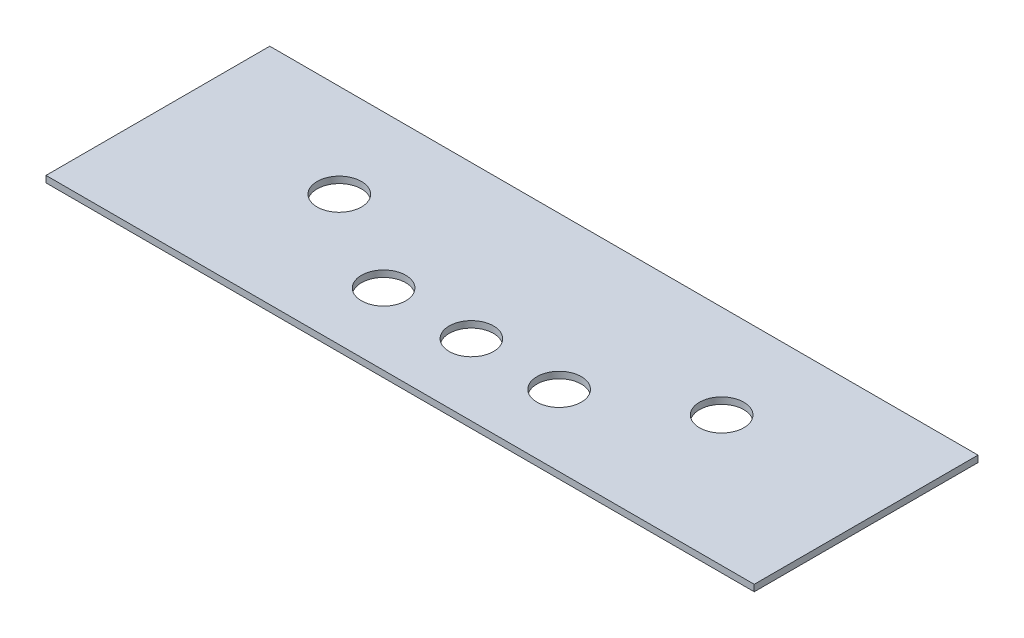
ISO-10303-21;
HEADER;
FILE_DESCRIPTION(('STEP AP214'),'2;1');
FILE_NAME('part.step','',(''),(''),'','','');
FILE_SCHEMA(('AUTOMOTIVE_DESIGN { 1 0 10303 214 1 1 1 1 }'));
ENDSEC;
DATA;
#1=APPLICATION_CONTEXT('core data for automotive mechanical design processes');
#2=APPLICATION_PROTOCOL_DEFINITION('international standard','automotive_design',2000,#1);
#3=PRODUCT_CONTEXT('',#1,'mechanical');
#4=PRODUCT('Part','Part','',(#3));
#5=PRODUCT_RELATED_PRODUCT_CATEGORY('part','',(#4));
#6=PRODUCT_DEFINITION_FORMATION('','',#4);
#7=PRODUCT_DEFINITION_CONTEXT('part definition',#1,'design');
#8=PRODUCT_DEFINITION('design','',#6,#7);
#9=PRODUCT_DEFINITION_SHAPE('','',#8);
#10=(LENGTH_UNIT() NAMED_UNIT(*) SI_UNIT(.MILLI.,.METRE.));
#11=(NAMED_UNIT(*) PLANE_ANGLE_UNIT() SI_UNIT($,.RADIAN.));
#12=(NAMED_UNIT(*) SI_UNIT($,.STERADIAN.) SOLID_ANGLE_UNIT());
#13=UNCERTAINTY_MEASURE_WITH_UNIT(LENGTH_MEASURE(1.E-05),#10,'distance_accuracy_value','');
#14=(GEOMETRIC_REPRESENTATION_CONTEXT(3) GLOBAL_UNCERTAINTY_ASSIGNED_CONTEXT((#13)) GLOBAL_UNIT_ASSIGNED_CONTEXT((#10,
#11,#12)) REPRESENTATION_CONTEXT('',''));
#15=CARTESIAN_POINT('',(0.,0.,0.));
#16=DIRECTION('',(0.,0.,1.));
#17=DIRECTION('',(1.,0.,0.));
#18=AXIS2_PLACEMENT_3D('',#15,#16,#17);
#19=CARTESIAN_POINT('',(-163.,3.,51.5));
#20=DIRECTION('',(1.,0.,0.));
#21=DIRECTION('',(0.,0.,-1.));
#22=AXIS2_PLACEMENT_3D('',#19,#20,#21);
#23=PLANE('',#22);
#24=DIRECTION('',(0.,0.,1.));
#25=VECTOR('',#24,1.);
#26=CARTESIAN_POINT('',(-163.,0.,51.5));
#27=LINE('',#26,#25);
#28=CARTESIAN_POINT('',(-163.,0.,-51.5));
#29=VERTEX_POINT('',#28);
#30=CARTESIAN_POINT('',(-163.,0.,51.5));
#31=VERTEX_POINT('',#30);
#32=EDGE_CURVE('E97',#29,#31,#27,.T.);
#33=ORIENTED_EDGE('',*,*,#32,.T.);
#34=DIRECTION('',(0.,-1.,0.));
#35=VECTOR('',#34,1.);
#36=CARTESIAN_POINT('',(-163.,3.,51.5));
#37=LINE('',#36,#35);
#38=CARTESIAN_POINT('',(-163.,3.,51.5));
#39=VERTEX_POINT('',#38);
#40=EDGE_CURVE('E11',#39,#31,#37,.T.);
#41=ORIENTED_EDGE('',*,*,#40,.F.);
#42=DIRECTION('',(0.,0.,1.));
#43=VECTOR('',#42,1.);
#44=CARTESIAN_POINT('',(-163.,3.,51.5));
#45=LINE('',#44,#43);
#46=CARTESIAN_POINT('',(-163.,3.,-51.5));
#47=VERTEX_POINT('',#46);
#48=EDGE_CURVE('E85',#47,#39,#45,.T.);
#49=ORIENTED_EDGE('',*,*,#48,.F.);
#50=DIRECTION('',(0.,-1.,0.));
#51=VECTOR('',#50,1.);
#52=CARTESIAN_POINT('',(-163.,3.,-51.5));
#53=LINE('',#52,#51);
#54=EDGE_CURVE('E93',#47,#29,#53,.T.);
#55=ORIENTED_EDGE('',*,*,#54,.T.);
#56=EDGE_LOOP('',(#33,#41,#49,#55));
#57=FACE_BOUND('',#56,.T.);
#58=ADVANCED_FACE('F34',(#57),#23,.F.);
#59=CARTESIAN_POINT('',(163.,3.,51.5));
#60=DIRECTION('',(0.,0.,-1.));
#61=DIRECTION('',(-1.,0.,0.));
#62=AXIS2_PLACEMENT_3D('',#59,#60,#61);
#63=PLANE('',#62);
#64=DIRECTION('',(1.,0.,0.));
#65=VECTOR('',#64,1.);
#66=CARTESIAN_POINT('',(163.,0.,51.5));
#67=LINE('',#66,#65);
#68=CARTESIAN_POINT('',(163.,0.,51.5));
#69=VERTEX_POINT('',#68);
#70=EDGE_CURVE('E89',#31,#69,#67,.T.);
#71=ORIENTED_EDGE('',*,*,#70,.T.);
#72=DIRECTION('',(0.,-1.,0.));
#73=VECTOR('',#72,1.);
#74=CARTESIAN_POINT('',(163.,3.,51.5));
#75=LINE('',#74,#73);
#76=CARTESIAN_POINT('',(163.,3.,51.5));
#77=VERTEX_POINT('',#76);
#78=EDGE_CURVE('E42',#77,#69,#75,.T.);
#79=ORIENTED_EDGE('',*,*,#78,.F.);
#80=DIRECTION('',(1.,0.,0.));
#81=VECTOR('',#80,1.);
#82=CARTESIAN_POINT('',(163.,3.,51.5));
#83=LINE('',#82,#81);
#84=EDGE_CURVE('E80',#39,#77,#83,.T.);
#85=ORIENTED_EDGE('',*,*,#84,.F.);
#86=ORIENTED_EDGE('',*,*,#40,.T.);
#87=EDGE_LOOP('',(#71,#79,#85,#86));
#88=FACE_BOUND('',#87,.T.);
#89=ADVANCED_FACE('F88',(#88),#63,.F.);
#90=CARTESIAN_POINT('',(163.,3.,51.5));
#91=DIRECTION('',(-1.,0.,0.));
#92=DIRECTION('',(0.,0.,1.));
#93=AXIS2_PLACEMENT_3D('',#90,#91,#92);
#94=PLANE('',#93);
#95=DIRECTION('',(0.,0.,-1.));
#96=VECTOR('',#95,1.);
#97=CARTESIAN_POINT('',(163.,0.,51.5));
#98=LINE('',#97,#96);
#99=CARTESIAN_POINT('',(163.,0.,-51.5));
#100=VERTEX_POINT('',#99);
#101=EDGE_CURVE('E67',#69,#100,#98,.T.);
#102=ORIENTED_EDGE('',*,*,#101,.T.);
#103=DIRECTION('',(0.,-1.,0.));
#104=VECTOR('',#103,1.);
#105=CARTESIAN_POINT('',(163.,3.,-51.5));
#106=LINE('',#105,#104);
#107=CARTESIAN_POINT('',(163.,3.,-51.5));
#108=VERTEX_POINT('',#107);
#109=EDGE_CURVE('E90',#108,#100,#106,.T.);
#110=ORIENTED_EDGE('',*,*,#109,.F.);
#111=DIRECTION('',(0.,0.,-1.));
#112=VECTOR('',#111,1.);
#113=CARTESIAN_POINT('',(163.,3.,51.5));
#114=LINE('',#113,#112);
#115=EDGE_CURVE('E83',#77,#108,#114,.T.);
#116=ORIENTED_EDGE('',*,*,#115,.F.);
#117=ORIENTED_EDGE('',*,*,#78,.T.);
#118=EDGE_LOOP('',(#102,#110,#116,#117));
#119=FACE_BOUND('',#118,.T.);
#120=ADVANCED_FACE('F91',(#119),#94,.F.);
#121=CARTESIAN_POINT('',(163.,3.,-51.5));
#122=DIRECTION('',(0.,0.,1.));
#123=DIRECTION('',(1.,0.,0.));
#124=AXIS2_PLACEMENT_3D('',#121,#122,#123);
#125=PLANE('',#124);
#126=DIRECTION('',(-1.,0.,0.));
#127=VECTOR('',#126,1.);
#128=CARTESIAN_POINT('',(163.,0.,-51.5));
#129=LINE('',#128,#127);
#130=EDGE_CURVE('E73',#100,#29,#129,.T.);
#131=ORIENTED_EDGE('',*,*,#130,.T.);
#132=ORIENTED_EDGE('',*,*,#54,.F.);
#133=DIRECTION('',(-1.,0.,0.));
#134=VECTOR('',#133,1.);
#135=CARTESIAN_POINT('',(163.,3.,-51.5));
#136=LINE('',#135,#134);
#137=EDGE_CURVE('E50',#108,#47,#136,.T.);
#138=ORIENTED_EDGE('',*,*,#137,.F.);
#139=ORIENTED_EDGE('',*,*,#109,.T.);
#140=EDGE_LOOP('',(#131,#132,#138,#139));
#141=FACE_BOUND('',#140,.T.);
#142=ADVANCED_FACE('F105',(#141),#125,.F.);
#143=CARTESIAN_POINT('',(0.,3.,0.));
#144=DIRECTION('',(0.,1.,0.));
#145=DIRECTION('',(0.,0.,1.));
#146=AXIS2_PLACEMENT_3D('',#143,#144,#145);
#147=PLANE('',#146);
#148=CARTESIAN_POINT('',(-88.,3.,-8.50000000000002));
#149=DIRECTION('',(0.,1.,0.));
#150=DIRECTION('',(0.,0.,1.));
#151=AXIS2_PLACEMENT_3D('',#148,#149,#150);
#152=CIRCLE('',#151,10.2);
#153=CARTESIAN_POINT('',(-88.,3.,1.69999999999998));
#154=VERTEX_POINT('',#153);
#155=EDGE_CURVE('E122',#154,#154,#152,.T.);
#156=ORIENTED_EDGE('',*,*,#155,.F.);
#157=EDGE_LOOP('',(#156));
#158=FACE_BOUND('',#157,.T.);
#159=CARTESIAN_POINT('',(40.4,3.,18.7));
#160=DIRECTION('',(0.,1.,0.));
#161=DIRECTION('',(0.,0.,1.));
#162=AXIS2_PLACEMENT_3D('',#159,#160,#161);
#163=CIRCLE('',#162,10.2);
#164=CARTESIAN_POINT('',(40.4,3.,28.9));
#165=VERTEX_POINT('',#164);
#166=EDGE_CURVE('E129',#165,#165,#163,.T.);
#167=ORIENTED_EDGE('',*,*,#166,.F.);
#168=EDGE_LOOP('',(#167));
#169=FACE_BOUND('',#168,.T.);
#170=CARTESIAN_POINT('',(0.,3.,18.7));
#171=DIRECTION('',(0.,1.,0.));
#172=DIRECTION('',(0.,0.,1.));
#173=AXIS2_PLACEMENT_3D('',#170,#171,#172);
#174=CIRCLE('',#173,10.2);
#175=CARTESIAN_POINT('',(0.,3.,28.9));
#176=VERTEX_POINT('',#175);
#177=EDGE_CURVE('E128',#176,#176,#174,.T.);
#178=ORIENTED_EDGE('',*,*,#177,.F.);
#179=EDGE_LOOP('',(#178));
#180=FACE_BOUND('',#179,.T.);
#181=CARTESIAN_POINT('',(-40.4,3.,18.7));
#182=DIRECTION('',(0.,1.,0.));
#183=DIRECTION('',(0.,0.,1.));
#184=AXIS2_PLACEMENT_3D('',#181,#182,#183);
#185=CIRCLE('',#184,10.2);
#186=CARTESIAN_POINT('',(-40.4,3.,28.9));
#187=VERTEX_POINT('',#186);
#188=EDGE_CURVE('E115',#187,#187,#185,.T.);
#189=ORIENTED_EDGE('',*,*,#188,.F.);
#190=EDGE_LOOP('',(#189));
#191=FACE_BOUND('',#190,.T.);
#192=CARTESIAN_POINT('',(88.,3.,-8.50000000000002));
#193=DIRECTION('',(0.,1.,0.));
#194=DIRECTION('',(0.,0.,1.));
#195=AXIS2_PLACEMENT_3D('',#192,#193,#194);
#196=CIRCLE('',#195,10.2);
#197=CARTESIAN_POINT('',(88.,3.,1.69999999999998));
#198=VERTEX_POINT('',#197);
#199=EDGE_CURVE('E114',#198,#198,#196,.T.);
#200=ORIENTED_EDGE('',*,*,#199,.F.);
#201=EDGE_LOOP('',(#200));
#202=FACE_BOUND('',#201,.T.);
#203=ORIENTED_EDGE('',*,*,#48,.T.);
#204=ORIENTED_EDGE('',*,*,#84,.T.);
#205=ORIENTED_EDGE('',*,*,#115,.T.);
#206=ORIENTED_EDGE('',*,*,#137,.T.);
#207=EDGE_LOOP('',(#203,#204,#205,#206));
#208=FACE_BOUND('',#207,.T.);
#209=ADVANCED_FACE('F81',(#158,#169,#180,#191,#202,#208),#147,.T.);
#210=CARTESIAN_POINT('',(0.,0.,0.));
#211=DIRECTION('',(0.,1.,0.));
#212=DIRECTION('',(0.,0.,1.));
#213=AXIS2_PLACEMENT_3D('',#210,#211,#212);
#214=PLANE('',#213);
#215=CARTESIAN_POINT('',(-88.,0.,-8.50000000000002));
#216=DIRECTION('',(0.,1.,0.));
#217=DIRECTION('',(0.,0.,1.));
#218=AXIS2_PLACEMENT_3D('',#215,#216,#217);
#219=CIRCLE('',#218,10.2);
#220=CARTESIAN_POINT('',(-88.,0.,1.69999999999998));
#221=VERTEX_POINT('',#220);
#222=EDGE_CURVE('E100',#221,#221,#219,.F.);
#223=ORIENTED_EDGE('',*,*,#222,.F.);
#224=EDGE_LOOP('',(#223));
#225=FACE_BOUND('',#224,.T.);
#226=CARTESIAN_POINT('',(40.4,0.,18.7));
#227=DIRECTION('',(0.,1.,0.));
#228=DIRECTION('',(0.,0.,1.));
#229=AXIS2_PLACEMENT_3D('',#226,#227,#228);
#230=CIRCLE('',#229,10.2);
#231=CARTESIAN_POINT('',(40.4,0.,28.9));
#232=VERTEX_POINT('',#231);
#233=EDGE_CURVE('E125',#232,#232,#230,.F.);
#234=ORIENTED_EDGE('',*,*,#233,.F.);
#235=EDGE_LOOP('',(#234));
#236=FACE_BOUND('',#235,.T.);
#237=CARTESIAN_POINT('',(0.,0.,18.7));
#238=DIRECTION('',(0.,1.,0.));
#239=DIRECTION('',(0.,0.,1.));
#240=AXIS2_PLACEMENT_3D('',#237,#238,#239);
#241=CIRCLE('',#240,10.2);
#242=CARTESIAN_POINT('',(0.,0.,28.9));
#243=VERTEX_POINT('',#242);
#244=EDGE_CURVE('E118',#243,#243,#241,.F.);
#245=ORIENTED_EDGE('',*,*,#244,.F.);
#246=EDGE_LOOP('',(#245));
#247=FACE_BOUND('',#246,.T.);
#248=CARTESIAN_POINT('',(-40.4,0.,18.7));
#249=DIRECTION('',(0.,1.,0.));
#250=DIRECTION('',(0.,0.,1.));
#251=AXIS2_PLACEMENT_3D('',#248,#249,#250);
#252=CIRCLE('',#251,10.2);
#253=CARTESIAN_POINT('',(-40.4,0.,28.9));
#254=VERTEX_POINT('',#253);
#255=EDGE_CURVE('E111',#254,#254,#252,.F.);
#256=ORIENTED_EDGE('',*,*,#255,.F.);
#257=EDGE_LOOP('',(#256));
#258=FACE_BOUND('',#257,.T.);
#259=CARTESIAN_POINT('',(88.,0.,-8.50000000000002));
#260=DIRECTION('',(0.,1.,0.));
#261=DIRECTION('',(0.,0.,1.));
#262=AXIS2_PLACEMENT_3D('',#259,#260,#261);
#263=CIRCLE('',#262,10.2);
#264=CARTESIAN_POINT('',(88.,0.,1.69999999999998));
#265=VERTEX_POINT('',#264);
#266=EDGE_CURVE('E119',#265,#265,#263,.F.);
#267=ORIENTED_EDGE('',*,*,#266,.F.);
#268=EDGE_LOOP('',(#267));
#269=FACE_BOUND('',#268,.T.);
#270=ORIENTED_EDGE('',*,*,#32,.F.);
#271=ORIENTED_EDGE('',*,*,#130,.F.);
#272=ORIENTED_EDGE('',*,*,#101,.F.);
#273=ORIENTED_EDGE('',*,*,#70,.F.);
#274=EDGE_LOOP('',(#270,#271,#272,#273));
#275=FACE_BOUND('',#274,.T.);
#276=ADVANCED_FACE('F108',(#225,#236,#247,#258,#269,#275),#214,.F.);
#277=CARTESIAN_POINT('',(88.,-28.8499566724111,-8.50000000000002));
#278=DIRECTION('',(0.,1.,0.));
#279=DIRECTION('',(0.,0.,1.));
#280=AXIS2_PLACEMENT_3D('',#277,#278,#279);
#281=CYLINDRICAL_SURFACE('',#280,10.2);
#282=ORIENTED_EDGE('',*,*,#266,.T.);
#283=EDGE_LOOP('',(#282));
#284=FACE_BOUND('',#283,.T.);
#285=ORIENTED_EDGE('',*,*,#199,.T.);
#286=EDGE_LOOP('',(#285));
#287=FACE_BOUND('',#286,.T.);
#288=ADVANCED_FACE('F154',(#284,#287),#281,.F.);
#289=CARTESIAN_POINT('',(-40.4,-28.8499566724111,18.7));
#290=DIRECTION('',(0.,1.,0.));
#291=DIRECTION('',(0.,0.,1.));
#292=AXIS2_PLACEMENT_3D('',#289,#290,#291);
#293=CYLINDRICAL_SURFACE('',#292,10.2);
#294=ORIENTED_EDGE('',*,*,#255,.T.);
#295=EDGE_LOOP('',(#294));
#296=FACE_BOUND('',#295,.T.);
#297=ORIENTED_EDGE('',*,*,#188,.T.);
#298=EDGE_LOOP('',(#297));
#299=FACE_BOUND('',#298,.T.);
#300=ADVANCED_FACE('F156',(#296,#299),#293,.F.);
#301=CARTESIAN_POINT('',(0.,-28.8499566724111,18.7));
#302=DIRECTION('',(0.,1.,0.));
#303=DIRECTION('',(0.,0.,1.));
#304=AXIS2_PLACEMENT_3D('',#301,#302,#303);
#305=CYLINDRICAL_SURFACE('',#304,10.2);
#306=ORIENTED_EDGE('',*,*,#244,.T.);
#307=EDGE_LOOP('',(#306));
#308=FACE_BOUND('',#307,.T.);
#309=ORIENTED_EDGE('',*,*,#177,.T.);
#310=EDGE_LOOP('',(#309));
#311=FACE_BOUND('',#310,.T.);
#312=ADVANCED_FACE('F163',(#308,#311),#305,.F.);
#313=CARTESIAN_POINT('',(40.4,-28.8499566724111,18.7));
#314=DIRECTION('',(0.,1.,0.));
#315=DIRECTION('',(0.,0.,1.));
#316=AXIS2_PLACEMENT_3D('',#313,#314,#315);
#317=CYLINDRICAL_SURFACE('',#316,10.2);
#318=ORIENTED_EDGE('',*,*,#233,.T.);
#319=EDGE_LOOP('',(#318));
#320=FACE_BOUND('',#319,.T.);
#321=ORIENTED_EDGE('',*,*,#166,.T.);
#322=EDGE_LOOP('',(#321));
#323=FACE_BOUND('',#322,.T.);
#324=ADVANCED_FACE('F212',(#320,#323),#317,.F.);
#325=CARTESIAN_POINT('',(-88.,-28.8499566724111,-8.50000000000002));
#326=DIRECTION('',(0.,1.,0.));
#327=DIRECTION('',(0.,0.,1.));
#328=AXIS2_PLACEMENT_3D('',#325,#326,#327);
#329=CYLINDRICAL_SURFACE('',#328,10.2);
#330=ORIENTED_EDGE('',*,*,#222,.T.);
#331=EDGE_LOOP('',(#330));
#332=FACE_BOUND('',#331,.T.);
#333=ORIENTED_EDGE('',*,*,#155,.T.);
#334=EDGE_LOOP('',(#333));
#335=FACE_BOUND('',#334,.T.);
#336=ADVANCED_FACE('F141',(#332,#335),#329,.F.);
#337=CLOSED_SHELL('',(#58,#89,#120,#142,#209,#276,#288,#300,#312,#324,#336));
#338=MANIFOLD_SOLID_BREP('B2',#337);
#339=ADVANCED_BREP_SHAPE_REPRESENTATION('',(#18,#338),#14);
#340=SHAPE_DEFINITION_REPRESENTATION(#9,#339);
ENDSEC;
END-ISO-10303-21;
